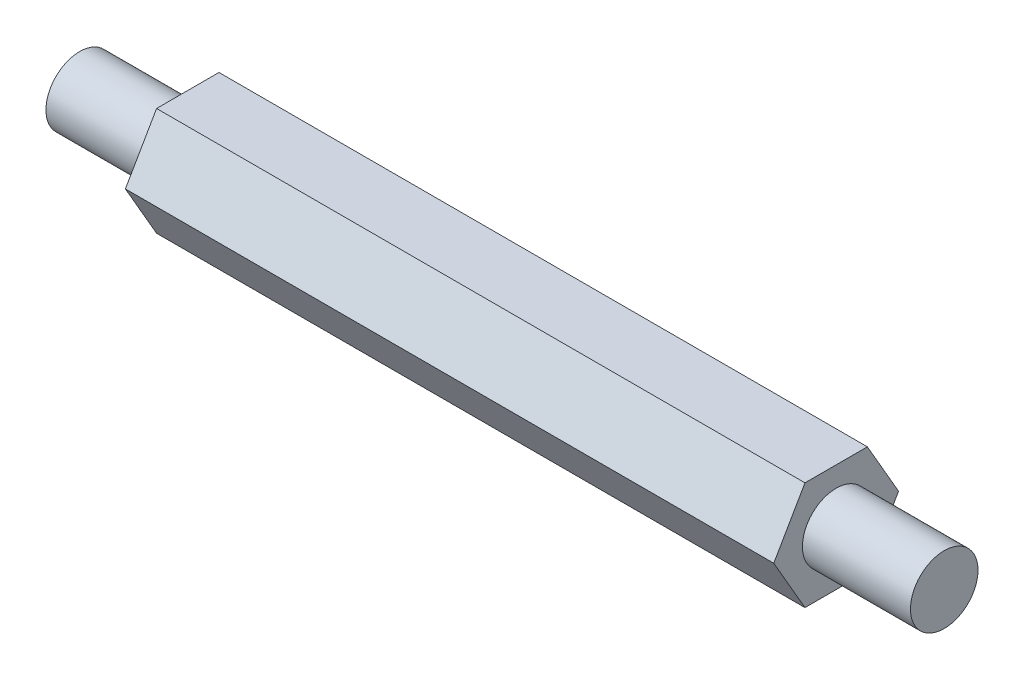
ISO-10303-21;
HEADER;
FILE_DESCRIPTION(('STEP AP214'),'2;1');
FILE_NAME('part.step','',(''),(''),'','','');
FILE_SCHEMA(('AUTOMOTIVE_DESIGN { 1 0 10303 214 1 1 1 1 }'));
ENDSEC;
DATA;
#1=APPLICATION_CONTEXT('core data for automotive mechanical design processes');
#2=APPLICATION_PROTOCOL_DEFINITION('international standard','automotive_design',2000,#1);
#3=PRODUCT_CONTEXT('',#1,'mechanical');
#4=PRODUCT('Part','Part','',(#3));
#5=PRODUCT_RELATED_PRODUCT_CATEGORY('part','',(#4));
#6=PRODUCT_DEFINITION_FORMATION('','',#4);
#7=PRODUCT_DEFINITION_CONTEXT('part definition',#1,'design');
#8=PRODUCT_DEFINITION('design','',#6,#7);
#9=PRODUCT_DEFINITION_SHAPE('','',#8);
#10=(LENGTH_UNIT() NAMED_UNIT(*) SI_UNIT(.MILLI.,.METRE.));
#11=(NAMED_UNIT(*) PLANE_ANGLE_UNIT() SI_UNIT($,.RADIAN.));
#12=(NAMED_UNIT(*) SI_UNIT($,.STERADIAN.) SOLID_ANGLE_UNIT());
#13=UNCERTAINTY_MEASURE_WITH_UNIT(LENGTH_MEASURE(1.E-05),#10,'distance_accuracy_value','');
#14=(GEOMETRIC_REPRESENTATION_CONTEXT(3) GLOBAL_UNCERTAINTY_ASSIGNED_CONTEXT((#13)) GLOBAL_UNIT_ASSIGNED_CONTEXT((#10,
#11,#12)) REPRESENTATION_CONTEXT('',''));
#15=CARTESIAN_POINT('',(0.,0.,0.));
#16=DIRECTION('',(0.,0.,1.));
#17=DIRECTION('',(1.,0.,0.));
#18=AXIS2_PLACEMENT_3D('',#15,#16,#17);
#19=CARTESIAN_POINT('',(203.2,-12.7,-7.33234841870825));
#20=DIRECTION('',(0.,0.5,0.866025403784439));
#21=DIRECTION('',(0.,-0.866025403784439,0.5));
#22=AXIS2_PLACEMENT_3D('',#19,#20,#21);
#23=PLANE('',#22);
#24=DIRECTION('',(-1.,0.,0.));
#25=VECTOR('',#24,1.);
#26=CARTESIAN_POINT('',(203.2,-12.7,-7.33234841870825));
#27=LINE('',#26,#25);
#28=CARTESIAN_POINT('',(177.8,-12.7,-7.33234841870825));
#29=VERTEX_POINT('',#28);
#30=CARTESIAN_POINT('',(25.4,-12.7,-7.33234841870825));
#31=VERTEX_POINT('',#30);
#32=EDGE_CURVE('E102',#29,#31,#27,.T.);
#33=ORIENTED_EDGE('',*,*,#32,.T.);
#34=DIRECTION('',(0.,0.866025403784439,-0.5));
#35=VECTOR('',#34,1.);
#36=CARTESIAN_POINT('',(25.4,-12.7,-7.33234841870825));
#37=LINE('',#36,#35);
#38=CARTESIAN_POINT('',(25.4,0.,-14.6646968374165));
#39=VERTEX_POINT('',#38);
#40=EDGE_CURVE('E49',#31,#39,#37,.T.);
#41=ORIENTED_EDGE('',*,*,#40,.T.);
#42=DIRECTION('',(-1.,0.,0.));
#43=VECTOR('',#42,1.);
#44=CARTESIAN_POINT('',(203.2,0.,-14.6646968374165));
#45=LINE('',#44,#43);
#46=CARTESIAN_POINT('',(177.8,0.,-14.6646968374165));
#47=VERTEX_POINT('',#46);
#48=EDGE_CURVE('E115',#47,#39,#45,.T.);
#49=ORIENTED_EDGE('',*,*,#48,.F.);
#50=DIRECTION('',(0.,0.866025403784439,-0.5));
#51=VECTOR('',#50,1.);
#52=CARTESIAN_POINT('',(177.8,-12.7,-7.33234841870825));
#53=LINE('',#52,#51);
#54=EDGE_CURVE('E106',#29,#47,#53,.T.);
#55=ORIENTED_EDGE('',*,*,#54,.F.);
#56=EDGE_LOOP('',(#33,#41,#49,#55));
#57=FACE_BOUND('',#56,.T.);
#58=ADVANCED_FACE('F35',(#57),#23,.F.);
#59=CARTESIAN_POINT('',(203.2,0.,-14.6646968374165));
#60=DIRECTION('',(0.,-0.5,0.866025403784439));
#61=DIRECTION('',(0.,-0.866025403784439,-0.5));
#62=AXIS2_PLACEMENT_3D('',#59,#60,#61);
#63=PLANE('',#62);
#64=ORIENTED_EDGE('',*,*,#48,.T.);
#65=DIRECTION('',(0.,0.866025403784439,0.5));
#66=VECTOR('',#65,1.);
#67=CARTESIAN_POINT('',(25.4,0.,-14.6646968374165));
#68=LINE('',#67,#66);
#69=CARTESIAN_POINT('',(25.4,12.7,-7.33234841870824));
#70=VERTEX_POINT('',#69);
#71=EDGE_CURVE('E137',#39,#70,#68,.T.);
#72=ORIENTED_EDGE('',*,*,#71,.T.);
#73=DIRECTION('',(-1.,0.,0.));
#74=VECTOR('',#73,1.);
#75=CARTESIAN_POINT('',(203.2,12.7,-7.33234841870824));
#76=LINE('',#75,#74);
#77=CARTESIAN_POINT('',(177.8,12.7,-7.33234841870824));
#78=VERTEX_POINT('',#77);
#79=EDGE_CURVE('E112',#78,#70,#76,.T.);
#80=ORIENTED_EDGE('',*,*,#79,.F.);
#81=DIRECTION('',(0.,0.866025403784439,0.5));
#82=VECTOR('',#81,1.);
#83=CARTESIAN_POINT('',(177.8,0.,-14.6646968374165));
#84=LINE('',#83,#82);
#85=EDGE_CURVE('E122',#47,#78,#84,.T.);
#86=ORIENTED_EDGE('',*,*,#85,.F.);
#87=EDGE_LOOP('',(#64,#72,#80,#86));
#88=FACE_BOUND('',#87,.T.);
#89=ADVANCED_FACE('F163',(#88),#63,.F.);
#90=CARTESIAN_POINT('',(203.2,12.7,-7.33234841870824));
#91=DIRECTION('',(0.,-1.,0.));
#92=DIRECTION('',(0.,0.,-1.));
#93=AXIS2_PLACEMENT_3D('',#90,#91,#92);
#94=PLANE('',#93);
#95=ORIENTED_EDGE('',*,*,#79,.T.);
#96=DIRECTION('',(0.,0.,1.));
#97=VECTOR('',#96,1.);
#98=CARTESIAN_POINT('',(25.4,12.7,-7.33234841870824));
#99=LINE('',#98,#97);
#100=CARTESIAN_POINT('',(25.4,12.7,7.33234841870826));
#101=VERTEX_POINT('',#100);
#102=EDGE_CURVE('E140',#70,#101,#99,.T.);
#103=ORIENTED_EDGE('',*,*,#102,.T.);
#104=DIRECTION('',(-1.,0.,0.));
#105=VECTOR('',#104,1.);
#106=CARTESIAN_POINT('',(203.2,12.7,7.33234841870826));
#107=LINE('',#106,#105);
#108=CARTESIAN_POINT('',(177.8,12.7,7.33234841870826));
#109=VERTEX_POINT('',#108);
#110=EDGE_CURVE('E104',#109,#101,#107,.T.);
#111=ORIENTED_EDGE('',*,*,#110,.F.);
#112=DIRECTION('',(0.,0.,1.));
#113=VECTOR('',#112,1.);
#114=CARTESIAN_POINT('',(177.8,12.7,-7.33234841870824));
#115=LINE('',#114,#113);
#116=EDGE_CURVE('E123',#78,#109,#115,.T.);
#117=ORIENTED_EDGE('',*,*,#116,.F.);
#118=EDGE_LOOP('',(#95,#103,#111,#117));
#119=FACE_BOUND('',#118,.T.);
#120=ADVANCED_FACE('F167',(#119),#94,.F.);
#121=CARTESIAN_POINT('',(203.2,12.7,7.33234841870826));
#122=DIRECTION('',(0.,-0.5,-0.866025403784439));
#123=DIRECTION('',(0.,0.866025403784439,-0.5));
#124=AXIS2_PLACEMENT_3D('',#121,#122,#123);
#125=PLANE('',#124);
#126=ORIENTED_EDGE('',*,*,#110,.T.);
#127=DIRECTION('',(0.,-0.866025403784439,0.5));
#128=VECTOR('',#127,1.);
#129=CARTESIAN_POINT('',(25.4,12.7,7.33234841870826));
#130=LINE('',#129,#128);
#131=CARTESIAN_POINT('',(25.4,0.,14.6646968374165));
#132=VERTEX_POINT('',#131);
#133=EDGE_CURVE('E98',#101,#132,#130,.T.);
#134=ORIENTED_EDGE('',*,*,#133,.T.);
#135=DIRECTION('',(-1.,0.,0.));
#136=VECTOR('',#135,1.);
#137=CARTESIAN_POINT('',(203.2,0.,14.6646968374165));
#138=LINE('',#137,#136);
#139=CARTESIAN_POINT('',(177.8,0.,14.6646968374165));
#140=VERTEX_POINT('',#139);
#141=EDGE_CURVE('E97',#140,#132,#138,.T.);
#142=ORIENTED_EDGE('',*,*,#141,.F.);
#143=DIRECTION('',(0.,-0.866025403784439,0.5));
#144=VECTOR('',#143,1.);
#145=CARTESIAN_POINT('',(177.8,12.7,7.33234841870826));
#146=LINE('',#145,#144);
#147=EDGE_CURVE('E127',#109,#140,#146,.T.);
#148=ORIENTED_EDGE('',*,*,#147,.F.);
#149=EDGE_LOOP('',(#126,#134,#142,#148));
#150=FACE_BOUND('',#149,.T.);
#151=ADVANCED_FACE('F172',(#150),#125,.F.);
#152=CARTESIAN_POINT('',(203.2,0.,14.6646968374165));
#153=DIRECTION('',(0.,0.5,-0.866025403784439));
#154=DIRECTION('',(0.,0.866025403784439,0.5));
#155=AXIS2_PLACEMENT_3D('',#152,#153,#154);
#156=PLANE('',#155);
#157=ORIENTED_EDGE('',*,*,#141,.T.);
#158=DIRECTION('',(0.,-0.866025403784439,-0.5));
#159=VECTOR('',#158,1.);
#160=CARTESIAN_POINT('',(25.4,0.,14.6646968374165));
#161=LINE('',#160,#159);
#162=CARTESIAN_POINT('',(25.4,-12.7,7.33234841870825));
#163=VERTEX_POINT('',#162);
#164=EDGE_CURVE('E85',#132,#163,#161,.T.);
#165=ORIENTED_EDGE('',*,*,#164,.T.);
#166=DIRECTION('',(-1.,0.,0.));
#167=VECTOR('',#166,1.);
#168=CARTESIAN_POINT('',(203.2,-12.7,7.33234841870825));
#169=LINE('',#168,#167);
#170=CARTESIAN_POINT('',(177.8,-12.7,7.33234841870825));
#171=VERTEX_POINT('',#170);
#172=EDGE_CURVE('E95',#171,#163,#169,.T.);
#173=ORIENTED_EDGE('',*,*,#172,.F.);
#174=DIRECTION('',(0.,-0.866025403784439,-0.5));
#175=VECTOR('',#174,1.);
#176=CARTESIAN_POINT('',(177.8,0.,14.6646968374165));
#177=LINE('',#176,#175);
#178=EDGE_CURVE('E56',#140,#171,#177,.T.);
#179=ORIENTED_EDGE('',*,*,#178,.F.);
#180=EDGE_LOOP('',(#157,#165,#173,#179));
#181=FACE_BOUND('',#180,.T.);
#182=ADVANCED_FACE('F94',(#181),#156,.F.);
#183=CARTESIAN_POINT('',(203.2,-12.7,7.33234841870825));
#184=DIRECTION('',(0.,1.,0.));
#185=DIRECTION('',(0.,0.,1.));
#186=AXIS2_PLACEMENT_3D('',#183,#184,#185);
#187=PLANE('',#186);
#188=ORIENTED_EDGE('',*,*,#172,.T.);
#189=DIRECTION('',(0.,0.,-1.));
#190=VECTOR('',#189,1.);
#191=CARTESIAN_POINT('',(25.4,-12.7,7.33234841870825));
#192=LINE('',#191,#190);
#193=EDGE_CURVE('E12',#163,#31,#192,.T.);
#194=ORIENTED_EDGE('',*,*,#193,.T.);
#195=ORIENTED_EDGE('',*,*,#32,.F.);
#196=DIRECTION('',(0.,0.,-1.));
#197=VECTOR('',#196,1.);
#198=CARTESIAN_POINT('',(177.8,-12.7,7.33234841870825));
#199=LINE('',#198,#197);
#200=EDGE_CURVE('E42',#171,#29,#199,.T.);
#201=ORIENTED_EDGE('',*,*,#200,.F.);
#202=EDGE_LOOP('',(#188,#194,#195,#201));
#203=FACE_BOUND('',#202,.T.);
#204=ADVANCED_FACE('F101',(#203),#187,.F.);
#205=CARTESIAN_POINT('',(177.8,0.,0.));
#206=DIRECTION('',(1.,0.,0.));
#207=DIRECTION('',(0.,0.,-1.));
#208=AXIS2_PLACEMENT_3D('',#205,#206,#207);
#209=PLANE('',#208);
#210=CARTESIAN_POINT('',(177.8,0.,0.));
#211=DIRECTION('',(1.,0.,0.));
#212=DIRECTION('',(0.,0.,-1.));
#213=AXIS2_PLACEMENT_3D('',#210,#211,#212);
#214=CIRCLE('',#213,7.9375);
#215=CARTESIAN_POINT('',(177.8,0.,-7.9375));
#216=VERTEX_POINT('',#215);
#217=EDGE_CURVE('E130',#216,#216,#214,.T.);
#218=ORIENTED_EDGE('',*,*,#217,.F.);
#219=EDGE_LOOP('',(#218));
#220=FACE_BOUND('',#219,.T.);
#221=ORIENTED_EDGE('',*,*,#54,.T.);
#222=ORIENTED_EDGE('',*,*,#85,.T.);
#223=ORIENTED_EDGE('',*,*,#116,.T.);
#224=ORIENTED_EDGE('',*,*,#147,.T.);
#225=ORIENTED_EDGE('',*,*,#178,.T.);
#226=ORIENTED_EDGE('',*,*,#200,.T.);
#227=EDGE_LOOP('',(#221,#222,#223,#224,#225,#226));
#228=FACE_BOUND('',#227,.T.);
#229=ADVANCED_FACE('F118',(#220,#228),#209,.T.);
#230=CARTESIAN_POINT('',(177.8,0.,0.));
#231=DIRECTION('',(1.,0.,0.));
#232=DIRECTION('',(0.,0.,-1.));
#233=AXIS2_PLACEMENT_3D('',#230,#231,#232);
#234=CYLINDRICAL_SURFACE('',#233,7.9375);
#235=ORIENTED_EDGE('',*,*,#217,.T.);
#236=EDGE_LOOP('',(#235));
#237=FACE_BOUND('',#236,.T.);
#238=CARTESIAN_POINT('',(203.2,0.,0.));
#239=DIRECTION('',(1.,0.,0.));
#240=DIRECTION('',(0.,0.,-1.));
#241=AXIS2_PLACEMENT_3D('',#238,#239,#240);
#242=CIRCLE('',#241,7.9375);
#243=CARTESIAN_POINT('',(203.2,0.,-7.9375));
#244=VERTEX_POINT('',#243);
#245=EDGE_CURVE('E131',#244,#244,#242,.T.);
#246=ORIENTED_EDGE('',*,*,#245,.F.);
#247=EDGE_LOOP('',(#246));
#248=FACE_BOUND('',#247,.T.);
#249=ADVANCED_FACE('F184',(#237,#248),#234,.T.);
#250=CARTESIAN_POINT('',(203.2,0.,0.));
#251=DIRECTION('',(1.,0.,0.));
#252=DIRECTION('',(0.,0.,-1.));
#253=AXIS2_PLACEMENT_3D('',#250,#251,#252);
#254=PLANE('',#253);
#255=ORIENTED_EDGE('',*,*,#245,.T.);
#256=EDGE_LOOP('',(#255));
#257=FACE_BOUND('',#256,.T.);
#258=ADVANCED_FACE('F190',(#257),#254,.T.);
#259=CARTESIAN_POINT('',(25.4,0.,0.));
#260=DIRECTION('',(1.,0.,0.));
#261=DIRECTION('',(0.,0.,-1.));
#262=AXIS2_PLACEMENT_3D('',#259,#260,#261);
#263=PLANE('',#262);
#264=CARTESIAN_POINT('',(25.4,0.,0.));
#265=DIRECTION('',(1.,0.,0.));
#266=DIRECTION('',(0.,0.,-1.));
#267=AXIS2_PLACEMENT_3D('',#264,#265,#266);
#268=CIRCLE('',#267,7.9375);
#269=CARTESIAN_POINT('',(25.4,0.,-7.9375));
#270=VERTEX_POINT('',#269);
#271=EDGE_CURVE('E144',#270,#270,#268,.T.);
#272=ORIENTED_EDGE('',*,*,#271,.T.);
#273=EDGE_LOOP('',(#272));
#274=FACE_BOUND('',#273,.T.);
#275=ORIENTED_EDGE('',*,*,#193,.F.);
#276=ORIENTED_EDGE('',*,*,#164,.F.);
#277=ORIENTED_EDGE('',*,*,#133,.F.);
#278=ORIENTED_EDGE('',*,*,#102,.F.);
#279=ORIENTED_EDGE('',*,*,#71,.F.);
#280=ORIENTED_EDGE('',*,*,#40,.F.);
#281=EDGE_LOOP('',(#275,#276,#277,#278,#279,#280));
#282=FACE_BOUND('',#281,.T.);
#283=ADVANCED_FACE('F84',(#274,#282),#263,.F.);
#284=CARTESIAN_POINT('',(0.,0.,0.));
#285=DIRECTION('',(1.,0.,0.));
#286=DIRECTION('',(0.,0.,-1.));
#287=AXIS2_PLACEMENT_3D('',#284,#285,#286);
#288=CYLINDRICAL_SURFACE('',#287,7.9375);
#289=CARTESIAN_POINT('',(0.,0.,0.));
#290=DIRECTION('',(1.,0.,0.));
#291=DIRECTION('',(0.,0.,-1.));
#292=AXIS2_PLACEMENT_3D('',#289,#290,#291);
#293=CIRCLE('',#292,7.9375);
#294=CARTESIAN_POINT('',(0.,0.,-7.9375));
#295=VERTEX_POINT('',#294);
#296=EDGE_CURVE('E99',#295,#295,#293,.T.);
#297=ORIENTED_EDGE('',*,*,#296,.T.);
#298=EDGE_LOOP('',(#297));
#299=FACE_BOUND('',#298,.T.);
#300=ORIENTED_EDGE('',*,*,#271,.F.);
#301=EDGE_LOOP('',(#300));
#302=FACE_BOUND('',#301,.T.);
#303=ADVANCED_FACE('F150',(#299,#302),#288,.T.);
#304=CARTESIAN_POINT('',(0.,0.,0.));
#305=DIRECTION('',(1.,0.,0.));
#306=DIRECTION('',(0.,0.,-1.));
#307=AXIS2_PLACEMENT_3D('',#304,#305,#306);
#308=PLANE('',#307);
#309=ORIENTED_EDGE('',*,*,#296,.F.);
#310=EDGE_LOOP('',(#309));
#311=FACE_BOUND('',#310,.T.);
#312=ADVANCED_FACE('F153',(#311),#308,.F.);
#313=CLOSED_SHELL('',(#58,#89,#120,#151,#182,#204,#229,#249,#258,#283,#303,#312));
#314=MANIFOLD_SOLID_BREP('B2',#313);
#315=ADVANCED_BREP_SHAPE_REPRESENTATION('',(#18,#314),#14);
#316=SHAPE_DEFINITION_REPRESENTATION(#9,#315);
ENDSEC;
END-ISO-10303-21;
